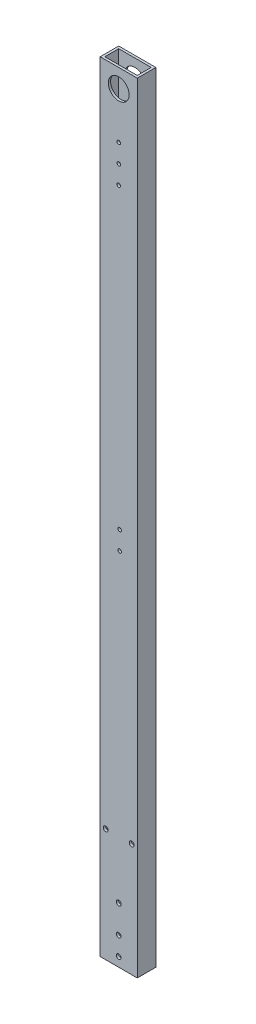
ISO-10303-21;
HEADER;
FILE_DESCRIPTION(('STEP AP214'),'2;1');
FILE_NAME('part.step','',(''),(''),'','','');
FILE_SCHEMA(('AUTOMOTIVE_DESIGN { 1 0 10303 214 1 1 1 1 }'));
ENDSEC;
DATA;
#1=APPLICATION_CONTEXT('core data for automotive mechanical design processes');
#2=APPLICATION_PROTOCOL_DEFINITION('international standard','automotive_design',2000,#1);
#3=PRODUCT_CONTEXT('',#1,'mechanical');
#4=PRODUCT('Part','Part','',(#3));
#5=PRODUCT_RELATED_PRODUCT_CATEGORY('part','',(#4));
#6=PRODUCT_DEFINITION_FORMATION('','',#4);
#7=PRODUCT_DEFINITION_CONTEXT('part definition',#1,'design');
#8=PRODUCT_DEFINITION('design','',#6,#7);
#9=PRODUCT_DEFINITION_SHAPE('','',#8);
#10=(LENGTH_UNIT() NAMED_UNIT(*) SI_UNIT(.MILLI.,.METRE.));
#11=(NAMED_UNIT(*) PLANE_ANGLE_UNIT() SI_UNIT($,.RADIAN.));
#12=(NAMED_UNIT(*) SI_UNIT($,.STERADIAN.) SOLID_ANGLE_UNIT());
#13=UNCERTAINTY_MEASURE_WITH_UNIT(LENGTH_MEASURE(1.E-05),#10,'distance_accuracy_value','');
#14=(GEOMETRIC_REPRESENTATION_CONTEXT(3) GLOBAL_UNCERTAINTY_ASSIGNED_CONTEXT((#13)) GLOBAL_UNIT_ASSIGNED_CONTEXT((#10,
#11,#12)) REPRESENTATION_CONTEXT('',''));
#15=CARTESIAN_POINT('',(0.,0.,0.));
#16=DIRECTION('',(0.,0.,1.));
#17=DIRECTION('',(1.,0.,0.));
#18=AXIS2_PLACEMENT_3D('',#15,#16,#17);
#19=CARTESIAN_POINT('',(0.,1066.8,0.));
#20=DIRECTION('',(0.,-1.,0.));
#21=DIRECTION('',(0.,0.,-1.));
#22=AXIS2_PLACEMENT_3D('',#19,#20,#21);
#23=PLANE('',#22);
#24=DIRECTION('',(0.,0.,-1.));
#25=VECTOR('',#24,1.);
#26=CARTESIAN_POINT('',(25.4,1066.8,12.7));
#27=LINE('',#26,#25);
#28=CARTESIAN_POINT('',(25.4,1066.8,12.7));
#29=VERTEX_POINT('',#28);
#30=CARTESIAN_POINT('',(25.4,1066.8,-12.7));
#31=VERTEX_POINT('',#30);
#32=EDGE_CURVE('E137',#29,#31,#27,.T.);
#33=ORIENTED_EDGE('',*,*,#32,.T.);
#34=DIRECTION('',(-1.,0.,0.));
#35=VECTOR('',#34,1.);
#36=CARTESIAN_POINT('',(-25.4,1066.8,-12.7));
#37=LINE('',#36,#35);
#38=CARTESIAN_POINT('',(-25.4,1066.8,-12.7));
#39=VERTEX_POINT('',#38);
#40=EDGE_CURVE('E140',#31,#39,#37,.T.);
#41=ORIENTED_EDGE('',*,*,#40,.T.);
#42=DIRECTION('',(0.,0.,1.));
#43=VECTOR('',#42,1.);
#44=CARTESIAN_POINT('',(-25.4,1066.8,12.7));
#45=LINE('',#44,#43);
#46=CARTESIAN_POINT('',(-25.4,1066.8,12.7));
#47=VERTEX_POINT('',#46);
#48=EDGE_CURVE('E143',#39,#47,#45,.T.);
#49=ORIENTED_EDGE('',*,*,#48,.T.);
#50=DIRECTION('',(1.,0.,0.));
#51=VECTOR('',#50,1.);
#52=CARTESIAN_POINT('',(-25.4,1066.8,12.7));
#53=LINE('',#52,#51);
#54=EDGE_CURVE('E145',#47,#29,#53,.T.);
#55=ORIENTED_EDGE('',*,*,#54,.T.);
#56=EDGE_LOOP('',(#33,#41,#49,#55));
#57=FACE_BOUND('',#56,.T.);
#58=DIRECTION('',(0.,0.,1.));
#59=VECTOR('',#58,1.);
#60=CARTESIAN_POINT('',(-22.225,1066.8,9.525));
#61=LINE('',#60,#59);
#62=CARTESIAN_POINT('',(-22.225,1066.8,-9.525));
#63=VERTEX_POINT('',#62);
#64=CARTESIAN_POINT('',(-22.225,1066.8,9.525));
#65=VERTEX_POINT('',#64);
#66=EDGE_CURVE('E99',#63,#65,#61,.T.);
#67=ORIENTED_EDGE('',*,*,#66,.F.);
#68=DIRECTION('',(-1.,0.,0.));
#69=VECTOR('',#68,1.);
#70=CARTESIAN_POINT('',(-22.225,1066.8,-9.525));
#71=LINE('',#70,#69);
#72=CARTESIAN_POINT('',(22.225,1066.8,-9.525));
#73=VERTEX_POINT('',#72);
#74=EDGE_CURVE('E121',#73,#63,#71,.T.);
#75=ORIENTED_EDGE('',*,*,#74,.F.);
#76=DIRECTION('',(0.,0.,-1.));
#77=VECTOR('',#76,1.);
#78=CARTESIAN_POINT('',(22.225,1066.8,9.525));
#79=LINE('',#78,#77);
#80=CARTESIAN_POINT('',(22.225,1066.8,9.525));
#81=VERTEX_POINT('',#80);
#82=EDGE_CURVE('E119',#81,#73,#79,.T.);
#83=ORIENTED_EDGE('',*,*,#82,.F.);
#84=DIRECTION('',(1.,0.,0.));
#85=VECTOR('',#84,1.);
#86=CARTESIAN_POINT('',(-22.225,1066.8,9.525));
#87=LINE('',#86,#85);
#88=EDGE_CURVE('E107',#65,#81,#87,.T.);
#89=ORIENTED_EDGE('',*,*,#88,.F.);
#90=EDGE_LOOP('',(#67,#75,#83,#89));
#91=FACE_BOUND('',#90,.T.);
#92=ADVANCED_FACE('F32',(#57,#91),#23,.F.);
#93=CARTESIAN_POINT('',(0.,0.,0.));
#94=DIRECTION('',(0.,-1.,0.));
#95=DIRECTION('',(0.,0.,-1.));
#96=AXIS2_PLACEMENT_3D('',#93,#94,#95);
#97=PLANE('',#96);
#98=DIRECTION('',(0.,0.,-1.));
#99=VECTOR('',#98,1.);
#100=CARTESIAN_POINT('',(25.4,0.,12.7));
#101=LINE('',#100,#99);
#102=CARTESIAN_POINT('',(25.4,0.,12.7));
#103=VERTEX_POINT('',#102);
#104=CARTESIAN_POINT('',(25.4,0.,-12.7));
#105=VERTEX_POINT('',#104);
#106=EDGE_CURVE('E115',#103,#105,#101,.T.);
#107=ORIENTED_EDGE('',*,*,#106,.F.);
#108=DIRECTION('',(1.,0.,0.));
#109=VECTOR('',#108,1.);
#110=CARTESIAN_POINT('',(-25.4,0.,12.7));
#111=LINE('',#110,#109);
#112=CARTESIAN_POINT('',(-25.4,0.,12.7));
#113=VERTEX_POINT('',#112);
#114=EDGE_CURVE('E141',#113,#103,#111,.T.);
#115=ORIENTED_EDGE('',*,*,#114,.F.);
#116=DIRECTION('',(0.,0.,1.));
#117=VECTOR('',#116,1.);
#118=CARTESIAN_POINT('',(-25.4,0.,12.7));
#119=LINE('',#118,#117);
#120=CARTESIAN_POINT('',(-25.4,0.,-12.7));
#121=VERTEX_POINT('',#120);
#122=EDGE_CURVE('E152',#121,#113,#119,.T.);
#123=ORIENTED_EDGE('',*,*,#122,.F.);
#124=DIRECTION('',(-1.,0.,0.));
#125=VECTOR('',#124,1.);
#126=CARTESIAN_POINT('',(-25.4,0.,-12.7));
#127=LINE('',#126,#125);
#128=EDGE_CURVE('E150',#105,#121,#127,.T.);
#129=ORIENTED_EDGE('',*,*,#128,.F.);
#130=EDGE_LOOP('',(#107,#115,#123,#129));
#131=FACE_BOUND('',#130,.T.);
#132=DIRECTION('',(-1.,0.,0.));
#133=VECTOR('',#132,1.);
#134=CARTESIAN_POINT('',(-22.225,0.,-9.525));
#135=LINE('',#134,#133);
#136=CARTESIAN_POINT('',(22.225,0.,-9.525));
#137=VERTEX_POINT('',#136);
#138=CARTESIAN_POINT('',(-22.225,0.,-9.525));
#139=VERTEX_POINT('',#138);
#140=EDGE_CURVE('E108',#137,#139,#135,.T.);
#141=ORIENTED_EDGE('',*,*,#140,.T.);
#142=DIRECTION('',(0.,0.,1.));
#143=VECTOR('',#142,1.);
#144=CARTESIAN_POINT('',(-22.225,0.,9.525));
#145=LINE('',#144,#143);
#146=CARTESIAN_POINT('',(-22.225,0.,9.525));
#147=VERTEX_POINT('',#146);
#148=EDGE_CURVE('E57',#139,#147,#145,.T.);
#149=ORIENTED_EDGE('',*,*,#148,.T.);
#150=DIRECTION('',(1.,0.,0.));
#151=VECTOR('',#150,1.);
#152=CARTESIAN_POINT('',(-22.225,0.,9.525));
#153=LINE('',#152,#151);
#154=CARTESIAN_POINT('',(22.225,0.,9.525));
#155=VERTEX_POINT('',#154);
#156=EDGE_CURVE('E114',#147,#155,#153,.T.);
#157=ORIENTED_EDGE('',*,*,#156,.T.);
#158=DIRECTION('',(0.,0.,-1.));
#159=VECTOR('',#158,1.);
#160=CARTESIAN_POINT('',(22.225,0.,9.525));
#161=LINE('',#160,#159);
#162=EDGE_CURVE('E129',#155,#137,#161,.T.);
#163=ORIENTED_EDGE('',*,*,#162,.T.);
#164=EDGE_LOOP('',(#141,#149,#157,#163));
#165=FACE_BOUND('',#164,.T.);
#166=ADVANCED_FACE('F306',(#131,#165),#97,.T.);
#167=CARTESIAN_POINT('',(25.4,1066.8,12.7));
#168=DIRECTION('',(-1.,0.,0.));
#169=DIRECTION('',(0.,0.,1.));
#170=AXIS2_PLACEMENT_3D('',#167,#168,#169);
#171=PLANE('',#170);
#172=ORIENTED_EDGE('',*,*,#106,.T.);
#173=DIRECTION('',(0.,-1.,0.));
#174=VECTOR('',#173,1.);
#175=CARTESIAN_POINT('',(25.4,1066.8,-12.7));
#176=LINE('',#175,#174);
#177=EDGE_CURVE('E11',#31,#105,#176,.T.);
#178=ORIENTED_EDGE('',*,*,#177,.F.);
#179=ORIENTED_EDGE('',*,*,#32,.F.);
#180=DIRECTION('',(0.,-1.,0.));
#181=VECTOR('',#180,1.);
#182=CARTESIAN_POINT('',(25.4,1066.8,12.7));
#183=LINE('',#182,#181);
#184=EDGE_CURVE('E147',#29,#103,#183,.T.);
#185=ORIENTED_EDGE('',*,*,#184,.T.);
#186=EDGE_LOOP('',(#172,#178,#179,#185));
#187=FACE_BOUND('',#186,.T.);
#188=ADVANCED_FACE('F34',(#187),#171,.F.);
#189=CARTESIAN_POINT('',(-25.4,1066.8,-12.7));
#190=DIRECTION('',(0.,0.,1.));
#191=DIRECTION('',(1.,0.,0.));
#192=AXIS2_PLACEMENT_3D('',#189,#190,#191);
#193=PLANE('',#192);
#194=CARTESIAN_POINT('',(17.7800000000001,155.17537,-12.7));
#195=DIRECTION('',(0.,0.,1.));
#196=DIRECTION('',(1.,0.,0.));
#197=AXIS2_PLACEMENT_3D('',#194,#195,#196);
#198=CIRCLE('',#197,3.3734375);
#199=CARTESIAN_POINT('',(21.1534375000001,155.17537,-12.7));
#200=VERTEX_POINT('',#199);
#201=EDGE_CURVE('E330',#200,#200,#198,.T.);
#202=ORIENTED_EDGE('',*,*,#201,.T.);
#203=EDGE_LOOP('',(#202));
#204=FACE_BOUND('',#203,.T.);
#205=CARTESIAN_POINT('',(-17.7799999999999,155.17537,-12.7));
#206=DIRECTION('',(0.,0.,1.));
#207=DIRECTION('',(1.,0.,0.));
#208=AXIS2_PLACEMENT_3D('',#205,#206,#207);
#209=CIRCLE('',#208,3.37343749999999);
#210=CARTESIAN_POINT('',(-14.4065624999999,155.17537,-12.7));
#211=VERTEX_POINT('',#210);
#212=EDGE_CURVE('E205',#211,#211,#209,.T.);
#213=ORIENTED_EDGE('',*,*,#212,.T.);
#214=EDGE_LOOP('',(#213));
#215=FACE_BOUND('',#214,.T.);
#216=CARTESIAN_POINT('',(0.,76.2,-12.7));
#217=DIRECTION('',(0.,0.,1.));
#218=DIRECTION('',(1.,0.,0.));
#219=AXIS2_PLACEMENT_3D('',#216,#217,#218);
#220=CIRCLE('',#219,3.3734375);
#221=CARTESIAN_POINT('',(3.3734375,76.2,-12.7));
#222=VERTEX_POINT('',#221);
#223=EDGE_CURVE('E201',#222,#222,#220,.T.);
#224=ORIENTED_EDGE('',*,*,#223,.T.);
#225=EDGE_LOOP('',(#224));
#226=FACE_BOUND('',#225,.T.);
#227=CARTESIAN_POINT('',(7.04991620636974E-12,952.5,-12.7));
#228=DIRECTION('',(0.,0.,1.));
#229=DIRECTION('',(1.,0.,0.));
#230=AXIS2_PLACEMENT_3D('',#227,#228,#229);
#231=CIRCLE('',#230,2.4638);
#232=CARTESIAN_POINT('',(2.46380000000705,952.5,-12.7));
#233=VERTEX_POINT('',#232);
#234=EDGE_CURVE('E185',#233,#233,#231,.T.);
#235=ORIENTED_EDGE('',*,*,#234,.T.);
#236=EDGE_LOOP('',(#235));
#237=FACE_BOUND('',#236,.T.);
#238=CARTESIAN_POINT('',(7.93809462606987E-12,927.1,-12.7));
#239=DIRECTION('',(0.,0.,1.));
#240=DIRECTION('',(1.,0.,0.));
#241=AXIS2_PLACEMENT_3D('',#238,#239,#240);
#242=CIRCLE('',#241,2.4638);
#243=CARTESIAN_POINT('',(2.46380000000794,927.1,-12.7));
#244=VERTEX_POINT('',#243);
#245=EDGE_CURVE('E234',#244,#244,#242,.T.);
#246=ORIENTED_EDGE('',*,*,#245,.T.);
#247=EDGE_LOOP('',(#246));
#248=FACE_BOUND('',#247,.T.);
#249=CARTESIAN_POINT('',(1.27000000000925,519.585439926055,-12.7));
#250=DIRECTION('',(0.,0.,1.));
#251=DIRECTION('',(1.,0.,0.));
#252=AXIS2_PLACEMENT_3D('',#249,#250,#251);
#253=CIRCLE('',#252,2.4638);
#254=CARTESIAN_POINT('',(3.73380000000926,519.585439926055,-12.7));
#255=VERTEX_POINT('',#254);
#256=EDGE_CURVE('E240',#255,#255,#253,.T.);
#257=ORIENTED_EDGE('',*,*,#256,.T.);
#258=EDGE_LOOP('',(#257));
#259=FACE_BOUND('',#258,.T.);
#260=CARTESIAN_POINT('',(1.27000000000919,494.185439926055,-12.7));
#261=DIRECTION('',(0.,0.,1.));
#262=DIRECTION('',(1.,0.,0.));
#263=AXIS2_PLACEMENT_3D('',#260,#261,#262);
#264=CIRCLE('',#263,2.46380000000001);
#265=CARTESIAN_POINT('',(3.73380000000919,494.185439926055,-12.7));
#266=VERTEX_POINT('',#265);
#267=EDGE_CURVE('E246',#266,#266,#264,.T.);
#268=ORIENTED_EDGE('',*,*,#267,.T.);
#269=EDGE_LOOP('',(#268));
#270=FACE_BOUND('',#269,.T.);
#271=CARTESIAN_POINT('',(7.93809462606987E-12,977.9,-12.7));
#272=DIRECTION('',(0.,0.,1.));
#273=DIRECTION('',(1.,0.,0.));
#274=AXIS2_PLACEMENT_3D('',#271,#272,#273);
#275=CIRCLE('',#274,2.4638);
#276=CARTESIAN_POINT('',(2.46380000000794,977.9,-12.7));
#277=VERTEX_POINT('',#276);
#278=EDGE_CURVE('E180',#277,#277,#275,.T.);
#279=ORIENTED_EDGE('',*,*,#278,.T.);
#280=EDGE_LOOP('',(#279));
#281=FACE_BOUND('',#280,.T.);
#282=CARTESIAN_POINT('',(0.,38.1,-12.7));
#283=DIRECTION('',(0.,0.,1.));
#284=DIRECTION('',(1.,0.,0.));
#285=AXIS2_PLACEMENT_3D('',#282,#283,#284);
#286=CIRCLE('',#285,3.175);
#287=CARTESIAN_POINT('',(3.175,38.1,-12.7));
#288=VERTEX_POINT('',#287);
#289=EDGE_CURVE('E175',#288,#288,#286,.T.);
#290=ORIENTED_EDGE('',*,*,#289,.T.);
#291=EDGE_LOOP('',(#290));
#292=FACE_BOUND('',#291,.T.);
#293=CARTESIAN_POINT('',(0.,12.7,-12.7));
#294=DIRECTION('',(0.,0.,1.));
#295=DIRECTION('',(1.,0.,0.));
#296=AXIS2_PLACEMENT_3D('',#293,#294,#295);
#297=CIRCLE('',#296,3.175);
#298=CARTESIAN_POINT('',(3.175,12.7,-12.7));
#299=VERTEX_POINT('',#298);
#300=EDGE_CURVE('E170',#299,#299,#297,.T.);
#301=ORIENTED_EDGE('',*,*,#300,.T.);
#302=EDGE_LOOP('',(#301));
#303=FACE_BOUND('',#302,.T.);
#304=CARTESIAN_POINT('',(0.,1041.4,-12.7));
#305=DIRECTION('',(0.,0.,1.));
#306=DIRECTION('',(1.,0.,0.));
#307=AXIS2_PLACEMENT_3D('',#304,#305,#306);
#308=CIRCLE('',#307,14.2875);
#309=CARTESIAN_POINT('',(14.2875,1041.4,-12.7));
#310=VERTEX_POINT('',#309);
#311=EDGE_CURVE('E165',#310,#310,#308,.T.);
#312=ORIENTED_EDGE('',*,*,#311,.T.);
#313=EDGE_LOOP('',(#312));
#314=FACE_BOUND('',#313,.T.);
#315=ORIENTED_EDGE('',*,*,#128,.T.);
#316=DIRECTION('',(0.,-1.,0.));
#317=VECTOR('',#316,1.);
#318=CARTESIAN_POINT('',(-25.4,1066.8,-12.7));
#319=LINE('',#318,#317);
#320=EDGE_CURVE('E41',#39,#121,#319,.T.);
#321=ORIENTED_EDGE('',*,*,#320,.F.);
#322=ORIENTED_EDGE('',*,*,#40,.F.);
#323=ORIENTED_EDGE('',*,*,#177,.T.);
#324=EDGE_LOOP('',(#315,#321,#322,#323));
#325=FACE_BOUND('',#324,.T.);
#326=ADVANCED_FACE('F320',(#204,#215,#226,#237,#248,#259,#270,#281,#292,#303,#314,#325),#193,.F.);
#327=CARTESIAN_POINT('',(-25.4,1066.8,12.7));
#328=DIRECTION('',(1.,0.,0.));
#329=DIRECTION('',(0.,0.,-1.));
#330=AXIS2_PLACEMENT_3D('',#327,#328,#329);
#331=PLANE('',#330);
#332=ORIENTED_EDGE('',*,*,#122,.T.);
#333=DIRECTION('',(0.,-1.,0.));
#334=VECTOR('',#333,1.);
#335=CARTESIAN_POINT('',(-25.4,1066.8,12.7));
#336=LINE('',#335,#334);
#337=EDGE_CURVE('E157',#47,#113,#336,.T.);
#338=ORIENTED_EDGE('',*,*,#337,.F.);
#339=ORIENTED_EDGE('',*,*,#48,.F.);
#340=ORIENTED_EDGE('',*,*,#320,.T.);
#341=EDGE_LOOP('',(#332,#338,#339,#340));
#342=FACE_BOUND('',#341,.T.);
#343=ADVANCED_FACE('F317',(#342),#331,.F.);
#344=CARTESIAN_POINT('',(-25.4,1066.8,12.7));
#345=DIRECTION('',(0.,0.,-1.));
#346=DIRECTION('',(-1.,0.,0.));
#347=AXIS2_PLACEMENT_3D('',#344,#345,#346);
#348=PLANE('',#347);
#349=CARTESIAN_POINT('',(17.7800000000001,155.17537,12.7));
#350=DIRECTION('',(0.,0.,1.));
#351=DIRECTION('',(1.,0.,0.));
#352=AXIS2_PLACEMENT_3D('',#349,#350,#351);
#353=CIRCLE('',#352,3.3734375);
#354=CARTESIAN_POINT('',(21.1534375000001,155.17537,12.7));
#355=VERTEX_POINT('',#354);
#356=EDGE_CURVE('E431',#355,#355,#353,.T.);
#357=ORIENTED_EDGE('',*,*,#356,.F.);
#358=EDGE_LOOP('',(#357));
#359=FACE_BOUND('',#358,.T.);
#360=CARTESIAN_POINT('',(-17.7799999999999,155.17537,12.7));
#361=DIRECTION('',(0.,0.,1.));
#362=DIRECTION('',(1.,0.,0.));
#363=AXIS2_PLACEMENT_3D('',#360,#361,#362);
#364=CIRCLE('',#363,3.37343749999999);
#365=CARTESIAN_POINT('',(-14.4065624999999,155.17537,12.7));
#366=VERTEX_POINT('',#365);
#367=EDGE_CURVE('E212',#366,#366,#364,.T.);
#368=ORIENTED_EDGE('',*,*,#367,.F.);
#369=EDGE_LOOP('',(#368));
#370=FACE_BOUND('',#369,.T.);
#371=CARTESIAN_POINT('',(0.,76.2,12.7));
#372=DIRECTION('',(0.,0.,1.));
#373=DIRECTION('',(1.,0.,0.));
#374=AXIS2_PLACEMENT_3D('',#371,#372,#373);
#375=CIRCLE('',#374,3.3734375);
#376=CARTESIAN_POINT('',(3.3734375,76.2,12.7));
#377=VERTEX_POINT('',#376);
#378=EDGE_CURVE('E209',#377,#377,#375,.T.);
#379=ORIENTED_EDGE('',*,*,#378,.F.);
#380=EDGE_LOOP('',(#379));
#381=FACE_BOUND('',#380,.T.);
#382=CARTESIAN_POINT('',(7.04991620636974E-12,952.5,12.7));
#383=DIRECTION('',(0.,0.,1.));
#384=DIRECTION('',(1.,0.,0.));
#385=AXIS2_PLACEMENT_3D('',#382,#383,#384);
#386=CIRCLE('',#385,2.4638);
#387=CARTESIAN_POINT('',(2.46380000000705,952.5,12.7));
#388=VERTEX_POINT('',#387);
#389=EDGE_CURVE('E231',#388,#388,#386,.T.);
#390=ORIENTED_EDGE('',*,*,#389,.F.);
#391=EDGE_LOOP('',(#390));
#392=FACE_BOUND('',#391,.T.);
#393=CARTESIAN_POINT('',(7.93809462606987E-12,927.1,12.7));
#394=DIRECTION('',(0.,0.,1.));
#395=DIRECTION('',(1.,0.,0.));
#396=AXIS2_PLACEMENT_3D('',#393,#394,#395);
#397=CIRCLE('',#396,2.4638);
#398=CARTESIAN_POINT('',(2.46380000000794,927.1,12.7));
#399=VERTEX_POINT('',#398);
#400=EDGE_CURVE('E237',#399,#399,#397,.T.);
#401=ORIENTED_EDGE('',*,*,#400,.F.);
#402=EDGE_LOOP('',(#401));
#403=FACE_BOUND('',#402,.T.);
#404=CARTESIAN_POINT('',(1.27000000000925,519.585439926055,12.7));
#405=DIRECTION('',(0.,0.,1.));
#406=DIRECTION('',(1.,0.,0.));
#407=AXIS2_PLACEMENT_3D('',#404,#405,#406);
#408=CIRCLE('',#407,2.4638);
#409=CARTESIAN_POINT('',(3.73380000000926,519.585439926055,12.7));
#410=VERTEX_POINT('',#409);
#411=EDGE_CURVE('E243',#410,#410,#408,.T.);
#412=ORIENTED_EDGE('',*,*,#411,.F.);
#413=EDGE_LOOP('',(#412));
#414=FACE_BOUND('',#413,.T.);
#415=CARTESIAN_POINT('',(1.27000000000919,494.185439926055,12.7));
#416=DIRECTION('',(0.,0.,1.));
#417=DIRECTION('',(1.,0.,0.));
#418=AXIS2_PLACEMENT_3D('',#415,#416,#417);
#419=CIRCLE('',#418,2.46380000000001);
#420=CARTESIAN_POINT('',(3.73380000000919,494.185439926055,12.7));
#421=VERTEX_POINT('',#420);
#422=EDGE_CURVE('E228',#421,#421,#419,.T.);
#423=ORIENTED_EDGE('',*,*,#422,.F.);
#424=EDGE_LOOP('',(#423));
#425=FACE_BOUND('',#424,.T.);
#426=CARTESIAN_POINT('',(7.93809462606987E-12,977.9,12.7));
#427=DIRECTION('',(0.,0.,1.));
#428=DIRECTION('',(1.,0.,0.));
#429=AXIS2_PLACEMENT_3D('',#426,#427,#428);
#430=CIRCLE('',#429,2.4638);
#431=CARTESIAN_POINT('',(2.46380000000794,977.9,12.7));
#432=VERTEX_POINT('',#431);
#433=EDGE_CURVE('E259',#432,#432,#430,.T.);
#434=ORIENTED_EDGE('',*,*,#433,.F.);
#435=EDGE_LOOP('',(#434));
#436=FACE_BOUND('',#435,.T.);
#437=CARTESIAN_POINT('',(0.,38.1,12.7));
#438=DIRECTION('',(0.,0.,1.));
#439=DIRECTION('',(1.,0.,0.));
#440=AXIS2_PLACEMENT_3D('',#437,#438,#439);
#441=CIRCLE('',#440,3.175);
#442=CARTESIAN_POINT('',(3.175,38.1,12.7));
#443=VERTEX_POINT('',#442);
#444=EDGE_CURVE('E266',#443,#443,#441,.T.);
#445=ORIENTED_EDGE('',*,*,#444,.F.);
#446=EDGE_LOOP('',(#445));
#447=FACE_BOUND('',#446,.T.);
#448=CARTESIAN_POINT('',(0.,12.7,12.7));
#449=DIRECTION('',(0.,0.,1.));
#450=DIRECTION('',(1.,0.,0.));
#451=AXIS2_PLACEMENT_3D('',#448,#449,#450);
#452=CIRCLE('',#451,3.175);
#453=CARTESIAN_POINT('',(3.175,12.7,12.7));
#454=VERTEX_POINT('',#453);
#455=EDGE_CURVE('E273',#454,#454,#452,.T.);
#456=ORIENTED_EDGE('',*,*,#455,.F.);
#457=EDGE_LOOP('',(#456));
#458=FACE_BOUND('',#457,.T.);
#459=CARTESIAN_POINT('',(0.,1041.4,12.7));
#460=DIRECTION('',(0.,0.,1.));
#461=DIRECTION('',(1.,0.,0.));
#462=AXIS2_PLACEMENT_3D('',#459,#460,#461);
#463=CIRCLE('',#462,14.2875);
#464=CARTESIAN_POINT('',(14.2875,1041.4,12.7));
#465=VERTEX_POINT('',#464);
#466=EDGE_CURVE('E280',#465,#465,#463,.T.);
#467=ORIENTED_EDGE('',*,*,#466,.F.);
#468=EDGE_LOOP('',(#467));
#469=FACE_BOUND('',#468,.T.);
#470=ORIENTED_EDGE('',*,*,#114,.T.);
#471=ORIENTED_EDGE('',*,*,#184,.F.);
#472=ORIENTED_EDGE('',*,*,#54,.F.);
#473=ORIENTED_EDGE('',*,*,#337,.T.);
#474=EDGE_LOOP('',(#470,#471,#472,#473));
#475=FACE_BOUND('',#474,.T.);
#476=ADVANCED_FACE('F301',(#359,#370,#381,#392,#403,#414,#425,#436,#447,#458,#469,#475),#348,.F.);
#477=CARTESIAN_POINT('',(-22.225,1066.8,9.525));
#478=DIRECTION('',(1.,0.,0.));
#479=DIRECTION('',(0.,0.,-1.));
#480=AXIS2_PLACEMENT_3D('',#477,#478,#479);
#481=PLANE('',#480);
#482=ORIENTED_EDGE('',*,*,#148,.F.);
#483=DIRECTION('',(0.,-1.,0.));
#484=VECTOR('',#483,1.);
#485=CARTESIAN_POINT('',(-22.225,1066.8,-9.525));
#486=LINE('',#485,#484);
#487=EDGE_CURVE('E103',#63,#139,#486,.T.);
#488=ORIENTED_EDGE('',*,*,#487,.F.);
#489=ORIENTED_EDGE('',*,*,#66,.T.);
#490=DIRECTION('',(0.,-1.,0.));
#491=VECTOR('',#490,1.);
#492=CARTESIAN_POINT('',(-22.225,1066.8,9.525));
#493=LINE('',#492,#491);
#494=EDGE_CURVE('E102',#65,#147,#493,.T.);
#495=ORIENTED_EDGE('',*,*,#494,.T.);
#496=EDGE_LOOP('',(#482,#488,#489,#495));
#497=FACE_BOUND('',#496,.T.);
#498=ADVANCED_FACE('F101',(#497),#481,.T.);
#499=CARTESIAN_POINT('',(-22.225,1066.8,9.525));
#500=DIRECTION('',(0.,0.,-1.));
#501=DIRECTION('',(-1.,0.,0.));
#502=AXIS2_PLACEMENT_3D('',#499,#500,#501);
#503=PLANE('',#502);
#504=CARTESIAN_POINT('',(17.7800000000001,155.17537,9.525));
#505=DIRECTION('',(0.,0.,-1.));
#506=DIRECTION('',(-1.,0.,0.));
#507=AXIS2_PLACEMENT_3D('',#504,#505,#506);
#508=CIRCLE('',#507,3.3734375);
#509=CARTESIAN_POINT('',(14.4065625000001,155.17537,9.525));
#510=VERTEX_POINT('',#509);
#511=EDGE_CURVE('E217',#510,#510,#508,.T.);
#512=ORIENTED_EDGE('',*,*,#511,.F.);
#513=EDGE_LOOP('',(#512));
#514=FACE_BOUND('',#513,.T.);
#515=CARTESIAN_POINT('',(-17.7799999999999,155.17537,9.525));
#516=DIRECTION('',(0.,0.,-1.));
#517=DIRECTION('',(-1.,0.,0.));
#518=AXIS2_PLACEMENT_3D('',#515,#516,#517);
#519=CIRCLE('',#518,3.37343749999999);
#520=CARTESIAN_POINT('',(-21.1534374999999,155.17537,9.525));
#521=VERTEX_POINT('',#520);
#522=EDGE_CURVE('E204',#521,#521,#519,.T.);
#523=ORIENTED_EDGE('',*,*,#522,.F.);
#524=EDGE_LOOP('',(#523));
#525=FACE_BOUND('',#524,.T.);
#526=CARTESIAN_POINT('',(0.,76.2,9.525));
#527=DIRECTION('',(0.,0.,-1.));
#528=DIRECTION('',(-1.,0.,0.));
#529=AXIS2_PLACEMENT_3D('',#526,#527,#528);
#530=CIRCLE('',#529,3.3734375);
#531=CARTESIAN_POINT('',(-3.3734375,76.2,9.525));
#532=VERTEX_POINT('',#531);
#533=EDGE_CURVE('E200',#532,#532,#530,.T.);
#534=ORIENTED_EDGE('',*,*,#533,.F.);
#535=EDGE_LOOP('',(#534));
#536=FACE_BOUND('',#535,.T.);
#537=CARTESIAN_POINT('',(7.04991620636974E-12,952.5,9.525));
#538=DIRECTION('',(0.,0.,-1.));
#539=DIRECTION('',(-1.,0.,0.));
#540=AXIS2_PLACEMENT_3D('',#537,#538,#539);
#541=CIRCLE('',#540,2.4638);
#542=CARTESIAN_POINT('',(-2.46379999999295,952.5,9.525));
#543=VERTEX_POINT('',#542);
#544=EDGE_CURVE('E197',#543,#543,#541,.T.);
#545=ORIENTED_EDGE('',*,*,#544,.F.);
#546=EDGE_LOOP('',(#545));
#547=FACE_BOUND('',#546,.T.);
#548=CARTESIAN_POINT('',(7.93809462606987E-12,927.1,9.525));
#549=DIRECTION('',(0.,0.,-1.));
#550=DIRECTION('',(-1.,0.,0.));
#551=AXIS2_PLACEMENT_3D('',#548,#549,#550);
#552=CIRCLE('',#551,2.4638);
#553=CARTESIAN_POINT('',(-2.46379999999207,927.1,9.525));
#554=VERTEX_POINT('',#553);
#555=EDGE_CURVE('E193',#554,#554,#552,.T.);
#556=ORIENTED_EDGE('',*,*,#555,.F.);
#557=EDGE_LOOP('',(#556));
#558=FACE_BOUND('',#557,.T.);
#559=CARTESIAN_POINT('',(1.27000000000925,519.585439926055,9.525));
#560=DIRECTION('',(0.,0.,-1.));
#561=DIRECTION('',(-1.,0.,0.));
#562=AXIS2_PLACEMENT_3D('',#559,#560,#561);
#563=CIRCLE('',#562,2.4638);
#564=CARTESIAN_POINT('',(-1.19379999999075,519.585439926055,9.525));
#565=VERTEX_POINT('',#564);
#566=EDGE_CURVE('E189',#565,#565,#563,.T.);
#567=ORIENTED_EDGE('',*,*,#566,.F.);
#568=EDGE_LOOP('',(#567));
#569=FACE_BOUND('',#568,.T.);
#570=CARTESIAN_POINT('',(1.27000000000919,494.185439926055,9.525));
#571=DIRECTION('',(0.,0.,-1.));
#572=DIRECTION('',(-1.,0.,0.));
#573=AXIS2_PLACEMENT_3D('',#570,#571,#572);
#574=CIRCLE('',#573,2.46380000000001);
#575=CARTESIAN_POINT('',(-1.19379999999082,494.185439926055,9.525));
#576=VERTEX_POINT('',#575);
#577=EDGE_CURVE('E184',#576,#576,#574,.T.);
#578=ORIENTED_EDGE('',*,*,#577,.F.);
#579=EDGE_LOOP('',(#578));
#580=FACE_BOUND('',#579,.T.);
#581=CARTESIAN_POINT('',(7.93809462606987E-12,977.9,9.525));
#582=DIRECTION('',(0.,0.,-1.));
#583=DIRECTION('',(-1.,0.,0.));
#584=AXIS2_PLACEMENT_3D('',#581,#582,#583);
#585=CIRCLE('',#584,2.4638);
#586=CARTESIAN_POINT('',(-2.46379999999207,977.9,9.525));
#587=VERTEX_POINT('',#586);
#588=EDGE_CURVE('E179',#587,#587,#585,.T.);
#589=ORIENTED_EDGE('',*,*,#588,.F.);
#590=EDGE_LOOP('',(#589));
#591=FACE_BOUND('',#590,.T.);
#592=CARTESIAN_POINT('',(0.,38.1,9.525));
#593=DIRECTION('',(0.,0.,-1.));
#594=DIRECTION('',(-1.,0.,0.));
#595=AXIS2_PLACEMENT_3D('',#592,#593,#594);
#596=CIRCLE('',#595,3.175);
#597=CARTESIAN_POINT('',(-3.175,38.1,9.525));
#598=VERTEX_POINT('',#597);
#599=EDGE_CURVE('E174',#598,#598,#596,.T.);
#600=ORIENTED_EDGE('',*,*,#599,.F.);
#601=EDGE_LOOP('',(#600));
#602=FACE_BOUND('',#601,.T.);
#603=CARTESIAN_POINT('',(0.,12.7,9.525));
#604=DIRECTION('',(0.,0.,-1.));
#605=DIRECTION('',(-1.,0.,0.));
#606=AXIS2_PLACEMENT_3D('',#603,#604,#605);
#607=CIRCLE('',#606,3.175);
#608=CARTESIAN_POINT('',(-3.175,12.7,9.525));
#609=VERTEX_POINT('',#608);
#610=EDGE_CURVE('E169',#609,#609,#607,.T.);
#611=ORIENTED_EDGE('',*,*,#610,.F.);
#612=EDGE_LOOP('',(#611));
#613=FACE_BOUND('',#612,.T.);
#614=CARTESIAN_POINT('',(0.,1041.4,9.525));
#615=DIRECTION('',(0.,0.,-1.));
#616=DIRECTION('',(-1.,0.,0.));
#617=AXIS2_PLACEMENT_3D('',#614,#615,#616);
#618=CIRCLE('',#617,14.2875);
#619=CARTESIAN_POINT('',(-14.2875,1041.4,9.525));
#620=VERTEX_POINT('',#619);
#621=EDGE_CURVE('E127',#620,#620,#618,.T.);
#622=ORIENTED_EDGE('',*,*,#621,.F.);
#623=EDGE_LOOP('',(#622));
#624=FACE_BOUND('',#623,.T.);
#625=ORIENTED_EDGE('',*,*,#156,.F.);
#626=ORIENTED_EDGE('',*,*,#494,.F.);
#627=ORIENTED_EDGE('',*,*,#88,.T.);
#628=DIRECTION('',(0.,-1.,0.));
#629=VECTOR('',#628,1.);
#630=CARTESIAN_POINT('',(22.225,1066.8,9.525));
#631=LINE('',#630,#629);
#632=EDGE_CURVE('E116',#81,#155,#631,.T.);
#633=ORIENTED_EDGE('',*,*,#632,.T.);
#634=EDGE_LOOP('',(#625,#626,#627,#633));
#635=FACE_BOUND('',#634,.T.);
#636=ADVANCED_FACE('F111',(#514,#525,#536,#547,#558,#569,#580,#591,#602,#613,#624,#635),#503,.T.);
#637=CARTESIAN_POINT('',(22.225,1066.8,9.525));
#638=DIRECTION('',(-1.,0.,0.));
#639=DIRECTION('',(0.,0.,1.));
#640=AXIS2_PLACEMENT_3D('',#637,#638,#639);
#641=PLANE('',#640);
#642=ORIENTED_EDGE('',*,*,#162,.F.);
#643=ORIENTED_EDGE('',*,*,#632,.F.);
#644=ORIENTED_EDGE('',*,*,#82,.T.);
#645=DIRECTION('',(0.,-1.,0.));
#646=VECTOR('',#645,1.);
#647=CARTESIAN_POINT('',(22.225,1066.8,-9.525));
#648=LINE('',#647,#646);
#649=EDGE_CURVE('E49',#73,#137,#648,.T.);
#650=ORIENTED_EDGE('',*,*,#649,.T.);
#651=EDGE_LOOP('',(#642,#643,#644,#650));
#652=FACE_BOUND('',#651,.T.);
#653=ADVANCED_FACE('F291',(#652),#641,.T.);
#654=CARTESIAN_POINT('',(-22.225,1066.8,-9.525));
#655=DIRECTION('',(0.,0.,1.));
#656=DIRECTION('',(1.,0.,0.));
#657=AXIS2_PLACEMENT_3D('',#654,#655,#656);
#658=PLANE('',#657);
#659=CARTESIAN_POINT('',(17.7800000000001,155.17537,-9.525));
#660=DIRECTION('',(0.,0.,1.));
#661=DIRECTION('',(1.,0.,0.));
#662=AXIS2_PLACEMENT_3D('',#659,#660,#661);
#663=CIRCLE('',#662,3.3734375);
#664=CARTESIAN_POINT('',(21.1534375000001,155.17537,-9.525));
#665=VERTEX_POINT('',#664);
#666=EDGE_CURVE('E36',#665,#665,#663,.T.);
#667=ORIENTED_EDGE('',*,*,#666,.F.);
#668=EDGE_LOOP('',(#667));
#669=FACE_BOUND('',#668,.T.);
#670=CARTESIAN_POINT('',(-17.7799999999999,155.17537,-9.525));
#671=DIRECTION('',(0.,0.,1.));
#672=DIRECTION('',(1.,0.,0.));
#673=AXIS2_PLACEMENT_3D('',#670,#671,#672);
#674=CIRCLE('',#673,3.37343749999999);
#675=CARTESIAN_POINT('',(-14.4065624999999,155.17537,-9.525));
#676=VERTEX_POINT('',#675);
#677=EDGE_CURVE('E202',#676,#676,#674,.T.);
#678=ORIENTED_EDGE('',*,*,#677,.F.);
#679=EDGE_LOOP('',(#678));
#680=FACE_BOUND('',#679,.T.);
#681=CARTESIAN_POINT('',(0.,76.2,-9.525));
#682=DIRECTION('',(0.,0.,1.));
#683=DIRECTION('',(1.,0.,0.));
#684=AXIS2_PLACEMENT_3D('',#681,#682,#683);
#685=CIRCLE('',#684,3.3734375);
#686=CARTESIAN_POINT('',(3.3734375,76.2,-9.525));
#687=VERTEX_POINT('',#686);
#688=EDGE_CURVE('E198',#687,#687,#685,.T.);
#689=ORIENTED_EDGE('',*,*,#688,.F.);
#690=EDGE_LOOP('',(#689));
#691=FACE_BOUND('',#690,.T.);
#692=CARTESIAN_POINT('',(7.04991620636974E-12,952.5,-9.525));
#693=DIRECTION('',(0.,0.,1.));
#694=DIRECTION('',(1.,0.,0.));
#695=AXIS2_PLACEMENT_3D('',#692,#693,#694);
#696=CIRCLE('',#695,2.4638);
#697=CARTESIAN_POINT('',(2.46380000000705,952.5,-9.525));
#698=VERTEX_POINT('',#697);
#699=EDGE_CURVE('E194',#698,#698,#696,.T.);
#700=ORIENTED_EDGE('',*,*,#699,.F.);
#701=EDGE_LOOP('',(#700));
#702=FACE_BOUND('',#701,.T.);
#703=CARTESIAN_POINT('',(7.93809462606987E-12,927.1,-9.525));
#704=DIRECTION('',(0.,0.,1.));
#705=DIRECTION('',(1.,0.,0.));
#706=AXIS2_PLACEMENT_3D('',#703,#704,#705);
#707=CIRCLE('',#706,2.4638);
#708=CARTESIAN_POINT('',(2.46380000000794,927.1,-9.525));
#709=VERTEX_POINT('',#708);
#710=EDGE_CURVE('E190',#709,#709,#707,.T.);
#711=ORIENTED_EDGE('',*,*,#710,.F.);
#712=EDGE_LOOP('',(#711));
#713=FACE_BOUND('',#712,.T.);
#714=CARTESIAN_POINT('',(1.27000000000925,519.585439926055,-9.525));
#715=DIRECTION('',(0.,0.,1.));
#716=DIRECTION('',(1.,0.,0.));
#717=AXIS2_PLACEMENT_3D('',#714,#715,#716);
#718=CIRCLE('',#717,2.4638);
#719=CARTESIAN_POINT('',(3.73380000000926,519.585439926055,-9.525));
#720=VERTEX_POINT('',#719);
#721=EDGE_CURVE('E186',#720,#720,#718,.T.);
#722=ORIENTED_EDGE('',*,*,#721,.F.);
#723=EDGE_LOOP('',(#722));
#724=FACE_BOUND('',#723,.T.);
#725=CARTESIAN_POINT('',(1.27000000000919,494.185439926055,-9.525));
#726=DIRECTION('',(0.,0.,1.));
#727=DIRECTION('',(1.,0.,0.));
#728=AXIS2_PLACEMENT_3D('',#725,#726,#727);
#729=CIRCLE('',#728,2.46380000000001);
#730=CARTESIAN_POINT('',(3.73380000000919,494.185439926055,-9.525));
#731=VERTEX_POINT('',#730);
#732=EDGE_CURVE('E181',#731,#731,#729,.T.);
#733=ORIENTED_EDGE('',*,*,#732,.F.);
#734=EDGE_LOOP('',(#733));
#735=FACE_BOUND('',#734,.T.);
#736=CARTESIAN_POINT('',(7.93809462606987E-12,977.9,-9.525));
#737=DIRECTION('',(0.,0.,1.));
#738=DIRECTION('',(1.,0.,0.));
#739=AXIS2_PLACEMENT_3D('',#736,#737,#738);
#740=CIRCLE('',#739,2.4638);
#741=CARTESIAN_POINT('',(2.46380000000794,977.9,-9.525));
#742=VERTEX_POINT('',#741);
#743=EDGE_CURVE('E176',#742,#742,#740,.T.);
#744=ORIENTED_EDGE('',*,*,#743,.F.);
#745=EDGE_LOOP('',(#744));
#746=FACE_BOUND('',#745,.T.);
#747=CARTESIAN_POINT('',(0.,38.1,-9.525));
#748=DIRECTION('',(0.,0.,1.));
#749=DIRECTION('',(1.,0.,0.));
#750=AXIS2_PLACEMENT_3D('',#747,#748,#749);
#751=CIRCLE('',#750,3.175);
#752=CARTESIAN_POINT('',(3.175,38.1,-9.525));
#753=VERTEX_POINT('',#752);
#754=EDGE_CURVE('E171',#753,#753,#751,.T.);
#755=ORIENTED_EDGE('',*,*,#754,.F.);
#756=EDGE_LOOP('',(#755));
#757=FACE_BOUND('',#756,.T.);
#758=CARTESIAN_POINT('',(0.,12.7,-9.525));
#759=DIRECTION('',(0.,0.,1.));
#760=DIRECTION('',(1.,0.,0.));
#761=AXIS2_PLACEMENT_3D('',#758,#759,#760);
#762=CIRCLE('',#761,3.175);
#763=CARTESIAN_POINT('',(3.175,12.7,-9.525));
#764=VERTEX_POINT('',#763);
#765=EDGE_CURVE('E166',#764,#764,#762,.T.);
#766=ORIENTED_EDGE('',*,*,#765,.F.);
#767=EDGE_LOOP('',(#766));
#768=FACE_BOUND('',#767,.T.);
#769=CARTESIAN_POINT('',(0.,1041.4,-9.525));
#770=DIRECTION('',(0.,0.,1.));
#771=DIRECTION('',(1.,0.,0.));
#772=AXIS2_PLACEMENT_3D('',#769,#770,#771);
#773=CIRCLE('',#772,14.2875);
#774=CARTESIAN_POINT('',(14.2875,1041.4,-9.525));
#775=VERTEX_POINT('',#774);
#776=EDGE_CURVE('E162',#775,#775,#773,.T.);
#777=ORIENTED_EDGE('',*,*,#776,.F.);
#778=EDGE_LOOP('',(#777));
#779=FACE_BOUND('',#778,.T.);
#780=ORIENTED_EDGE('',*,*,#140,.F.);
#781=ORIENTED_EDGE('',*,*,#649,.F.);
#782=ORIENTED_EDGE('',*,*,#74,.T.);
#783=ORIENTED_EDGE('',*,*,#487,.T.);
#784=EDGE_LOOP('',(#780,#781,#782,#783));
#785=FACE_BOUND('',#784,.T.);
#786=ADVANCED_FACE('F298',(#669,#680,#691,#702,#713,#724,#735,#746,#757,#768,#779,#785),#658,.T.);
#787=CARTESIAN_POINT('',(0.,1041.4,-12.7));
#788=DIRECTION('',(0.,0.,1.));
#789=DIRECTION('',(1.,0.,0.));
#790=AXIS2_PLACEMENT_3D('',#787,#788,#789);
#791=CYLINDRICAL_SURFACE('',#790,14.2875);
#792=ORIENTED_EDGE('',*,*,#776,.T.);
#793=EDGE_LOOP('',(#792));
#794=FACE_BOUND('',#793,.T.);
#795=ORIENTED_EDGE('',*,*,#311,.F.);
#796=EDGE_LOOP('',(#795));
#797=FACE_BOUND('',#796,.T.);
#798=ADVANCED_FACE('F364',(#794,#797),#791,.F.);
#799=ORIENTED_EDGE('',*,*,#621,.T.);
#800=EDGE_LOOP('',(#799));
#801=FACE_BOUND('',#800,.T.);
#802=ORIENTED_EDGE('',*,*,#466,.T.);
#803=EDGE_LOOP('',(#802));
#804=FACE_BOUND('',#803,.T.);
#805=ADVANCED_FACE('F287',(#801,#804),#791,.F.);
#806=CARTESIAN_POINT('',(0.,12.7,-12.7));
#807=DIRECTION('',(0.,0.,1.));
#808=DIRECTION('',(1.,0.,0.));
#809=AXIS2_PLACEMENT_3D('',#806,#807,#808);
#810=CYLINDRICAL_SURFACE('',#809,3.175);
#811=ORIENTED_EDGE('',*,*,#765,.T.);
#812=EDGE_LOOP('',(#811));
#813=FACE_BOUND('',#812,.T.);
#814=ORIENTED_EDGE('',*,*,#300,.F.);
#815=EDGE_LOOP('',(#814));
#816=FACE_BOUND('',#815,.T.);
#817=ADVANCED_FACE('F375',(#813,#816),#810,.F.);
#818=ORIENTED_EDGE('',*,*,#610,.T.);
#819=EDGE_LOOP('',(#818));
#820=FACE_BOUND('',#819,.T.);
#821=ORIENTED_EDGE('',*,*,#455,.T.);
#822=EDGE_LOOP('',(#821));
#823=FACE_BOUND('',#822,.T.);
#824=ADVANCED_FACE('F378',(#820,#823),#810,.F.);
#825=CARTESIAN_POINT('',(0.,38.1,-12.7));
#826=DIRECTION('',(0.,0.,1.));
#827=DIRECTION('',(1.,0.,0.));
#828=AXIS2_PLACEMENT_3D('',#825,#826,#827);
#829=CYLINDRICAL_SURFACE('',#828,3.175);
#830=ORIENTED_EDGE('',*,*,#754,.T.);
#831=EDGE_LOOP('',(#830));
#832=FACE_BOUND('',#831,.T.);
#833=ORIENTED_EDGE('',*,*,#289,.F.);
#834=EDGE_LOOP('',(#833));
#835=FACE_BOUND('',#834,.T.);
#836=ADVANCED_FACE('F380',(#832,#835),#829,.F.);
#837=ORIENTED_EDGE('',*,*,#599,.T.);
#838=EDGE_LOOP('',(#837));
#839=FACE_BOUND('',#838,.T.);
#840=ORIENTED_EDGE('',*,*,#444,.T.);
#841=EDGE_LOOP('',(#840));
#842=FACE_BOUND('',#841,.T.);
#843=ADVANCED_FACE('F383',(#839,#842),#829,.F.);
#844=CARTESIAN_POINT('',(7.93809462606987E-12,977.9,-12.7));
#845=DIRECTION('',(0.,0.,1.));
#846=DIRECTION('',(1.,0.,0.));
#847=AXIS2_PLACEMENT_3D('',#844,#845,#846);
#848=CYLINDRICAL_SURFACE('',#847,2.4638);
#849=ORIENTED_EDGE('',*,*,#743,.T.);
#850=EDGE_LOOP('',(#849));
#851=FACE_BOUND('',#850,.T.);
#852=ORIENTED_EDGE('',*,*,#278,.F.);
#853=EDGE_LOOP('',(#852));
#854=FACE_BOUND('',#853,.T.);
#855=ADVANCED_FACE('F385',(#851,#854),#848,.F.);
#856=ORIENTED_EDGE('',*,*,#588,.T.);
#857=EDGE_LOOP('',(#856));
#858=FACE_BOUND('',#857,.T.);
#859=ORIENTED_EDGE('',*,*,#433,.T.);
#860=EDGE_LOOP('',(#859));
#861=FACE_BOUND('',#860,.T.);
#862=ADVANCED_FACE('F388',(#858,#861),#848,.F.);
#863=CARTESIAN_POINT('',(1.27000000000919,494.185439926055,-12.7));
#864=DIRECTION('',(0.,0.,1.));
#865=DIRECTION('',(1.,0.,0.));
#866=AXIS2_PLACEMENT_3D('',#863,#864,#865);
#867=CYLINDRICAL_SURFACE('',#866,2.46380000000001);
#868=ORIENTED_EDGE('',*,*,#732,.T.);
#869=EDGE_LOOP('',(#868));
#870=FACE_BOUND('',#869,.T.);
#871=ORIENTED_EDGE('',*,*,#267,.F.);
#872=EDGE_LOOP('',(#871));
#873=FACE_BOUND('',#872,.T.);
#874=ADVANCED_FACE('F390',(#870,#873),#867,.F.);
#875=CARTESIAN_POINT('',(1.27000000000925,519.585439926055,-12.7));
#876=DIRECTION('',(0.,0.,1.));
#877=DIRECTION('',(1.,0.,0.));
#878=AXIS2_PLACEMENT_3D('',#875,#876,#877);
#879=CYLINDRICAL_SURFACE('',#878,2.4638);
#880=ORIENTED_EDGE('',*,*,#721,.T.);
#881=EDGE_LOOP('',(#880));
#882=FACE_BOUND('',#881,.T.);
#883=ORIENTED_EDGE('',*,*,#256,.F.);
#884=EDGE_LOOP('',(#883));
#885=FACE_BOUND('',#884,.T.);
#886=ADVANCED_FACE('F393',(#882,#885),#879,.F.);
#887=CARTESIAN_POINT('',(7.93809462606987E-12,927.1,-12.7));
#888=DIRECTION('',(0.,0.,1.));
#889=DIRECTION('',(1.,0.,0.));
#890=AXIS2_PLACEMENT_3D('',#887,#888,#889);
#891=CYLINDRICAL_SURFACE('',#890,2.4638);
#892=ORIENTED_EDGE('',*,*,#710,.T.);
#893=EDGE_LOOP('',(#892));
#894=FACE_BOUND('',#893,.T.);
#895=ORIENTED_EDGE('',*,*,#245,.F.);
#896=EDGE_LOOP('',(#895));
#897=FACE_BOUND('',#896,.T.);
#898=ADVANCED_FACE('F398',(#894,#897),#891,.F.);
#899=CARTESIAN_POINT('',(7.04991620636974E-12,952.5,-12.7));
#900=DIRECTION('',(0.,0.,1.));
#901=DIRECTION('',(1.,0.,0.));
#902=AXIS2_PLACEMENT_3D('',#899,#900,#901);
#903=CYLINDRICAL_SURFACE('',#902,2.4638);
#904=ORIENTED_EDGE('',*,*,#699,.T.);
#905=EDGE_LOOP('',(#904));
#906=FACE_BOUND('',#905,.T.);
#907=ORIENTED_EDGE('',*,*,#234,.F.);
#908=EDGE_LOOP('',(#907));
#909=FACE_BOUND('',#908,.T.);
#910=ADVANCED_FACE('F403',(#906,#909),#903,.F.);
#911=ORIENTED_EDGE('',*,*,#577,.T.);
#912=EDGE_LOOP('',(#911));
#913=FACE_BOUND('',#912,.T.);
#914=ORIENTED_EDGE('',*,*,#422,.T.);
#915=EDGE_LOOP('',(#914));
#916=FACE_BOUND('',#915,.T.);
#917=ADVANCED_FACE('F395',(#913,#916),#867,.F.);
#918=ORIENTED_EDGE('',*,*,#566,.T.);
#919=EDGE_LOOP('',(#918));
#920=FACE_BOUND('',#919,.T.);
#921=ORIENTED_EDGE('',*,*,#411,.T.);
#922=EDGE_LOOP('',(#921));
#923=FACE_BOUND('',#922,.T.);
#924=ADVANCED_FACE('F400',(#920,#923),#879,.F.);
#925=ORIENTED_EDGE('',*,*,#555,.T.);
#926=EDGE_LOOP('',(#925));
#927=FACE_BOUND('',#926,.T.);
#928=ORIENTED_EDGE('',*,*,#400,.T.);
#929=EDGE_LOOP('',(#928));
#930=FACE_BOUND('',#929,.T.);
#931=ADVANCED_FACE('F405',(#927,#930),#891,.F.);
#932=ORIENTED_EDGE('',*,*,#544,.T.);
#933=EDGE_LOOP('',(#932));
#934=FACE_BOUND('',#933,.T.);
#935=ORIENTED_EDGE('',*,*,#389,.T.);
#936=EDGE_LOOP('',(#935));
#937=FACE_BOUND('',#936,.T.);
#938=ADVANCED_FACE('F409',(#934,#937),#903,.F.);
#939=CARTESIAN_POINT('',(0.,76.2,-12.7));
#940=DIRECTION('',(0.,0.,1.));
#941=DIRECTION('',(1.,0.,0.));
#942=AXIS2_PLACEMENT_3D('',#939,#940,#941);
#943=CYLINDRICAL_SURFACE('',#942,3.3734375);
#944=ORIENTED_EDGE('',*,*,#688,.T.);
#945=EDGE_LOOP('',(#944));
#946=FACE_BOUND('',#945,.T.);
#947=ORIENTED_EDGE('',*,*,#223,.F.);
#948=EDGE_LOOP('',(#947));
#949=FACE_BOUND('',#948,.T.);
#950=ADVANCED_FACE('F410',(#946,#949),#943,.F.);
#951=ORIENTED_EDGE('',*,*,#533,.T.);
#952=EDGE_LOOP('',(#951));
#953=FACE_BOUND('',#952,.T.);
#954=ORIENTED_EDGE('',*,*,#378,.T.);
#955=EDGE_LOOP('',(#954));
#956=FACE_BOUND('',#955,.T.);
#957=ADVANCED_FACE('F413',(#953,#956),#943,.F.);
#958=CARTESIAN_POINT('',(-17.7799999999999,155.17537,-12.7));
#959=DIRECTION('',(0.,0.,1.));
#960=DIRECTION('',(1.,0.,0.));
#961=AXIS2_PLACEMENT_3D('',#958,#959,#960);
#962=CYLINDRICAL_SURFACE('',#961,3.37343749999999);
#963=ORIENTED_EDGE('',*,*,#677,.T.);
#964=EDGE_LOOP('',(#963));
#965=FACE_BOUND('',#964,.T.);
#966=ORIENTED_EDGE('',*,*,#212,.F.);
#967=EDGE_LOOP('',(#966));
#968=FACE_BOUND('',#967,.T.);
#969=ADVANCED_FACE('F415',(#965,#968),#962,.F.);
#970=ORIENTED_EDGE('',*,*,#522,.T.);
#971=EDGE_LOOP('',(#970));
#972=FACE_BOUND('',#971,.T.);
#973=ORIENTED_EDGE('',*,*,#367,.T.);
#974=EDGE_LOOP('',(#973));
#975=FACE_BOUND('',#974,.T.);
#976=ADVANCED_FACE('F418',(#972,#975),#962,.F.);
#977=CARTESIAN_POINT('',(17.7800000000001,155.17537,-12.7));
#978=DIRECTION('',(0.,0.,1.));
#979=DIRECTION('',(1.,0.,0.));
#980=AXIS2_PLACEMENT_3D('',#977,#978,#979);
#981=CYLINDRICAL_SURFACE('',#980,3.3734375);
#982=ORIENTED_EDGE('',*,*,#666,.T.);
#983=EDGE_LOOP('',(#982));
#984=FACE_BOUND('',#983,.T.);
#985=ORIENTED_EDGE('',*,*,#201,.F.);
#986=EDGE_LOOP('',(#985));
#987=FACE_BOUND('',#986,.T.);
#988=ADVANCED_FACE('F419',(#984,#987),#981,.F.);
#989=ORIENTED_EDGE('',*,*,#511,.T.);
#990=EDGE_LOOP('',(#989));
#991=FACE_BOUND('',#990,.T.);
#992=ORIENTED_EDGE('',*,*,#356,.T.);
#993=EDGE_LOOP('',(#992));
#994=FACE_BOUND('',#993,.T.);
#995=ADVANCED_FACE('F421',(#991,#994),#981,.F.);
#996=CLOSED_SHELL('',(#92,#166,#188,#326,#343,#476,#498,#636,#653,#786,#798,#805,#817,#824,#836,
#843,#855,#862,#874,#886,#898,#910,#917,#924,#931,#938,#950,#957,#969,#976,#988,#995));
#997=MANIFOLD_SOLID_BREP('B2',#996);
#998=ADVANCED_BREP_SHAPE_REPRESENTATION('',(#18,#997),#14);
#999=SHAPE_DEFINITION_REPRESENTATION(#9,#998);
ENDSEC;
END-ISO-10303-21;
